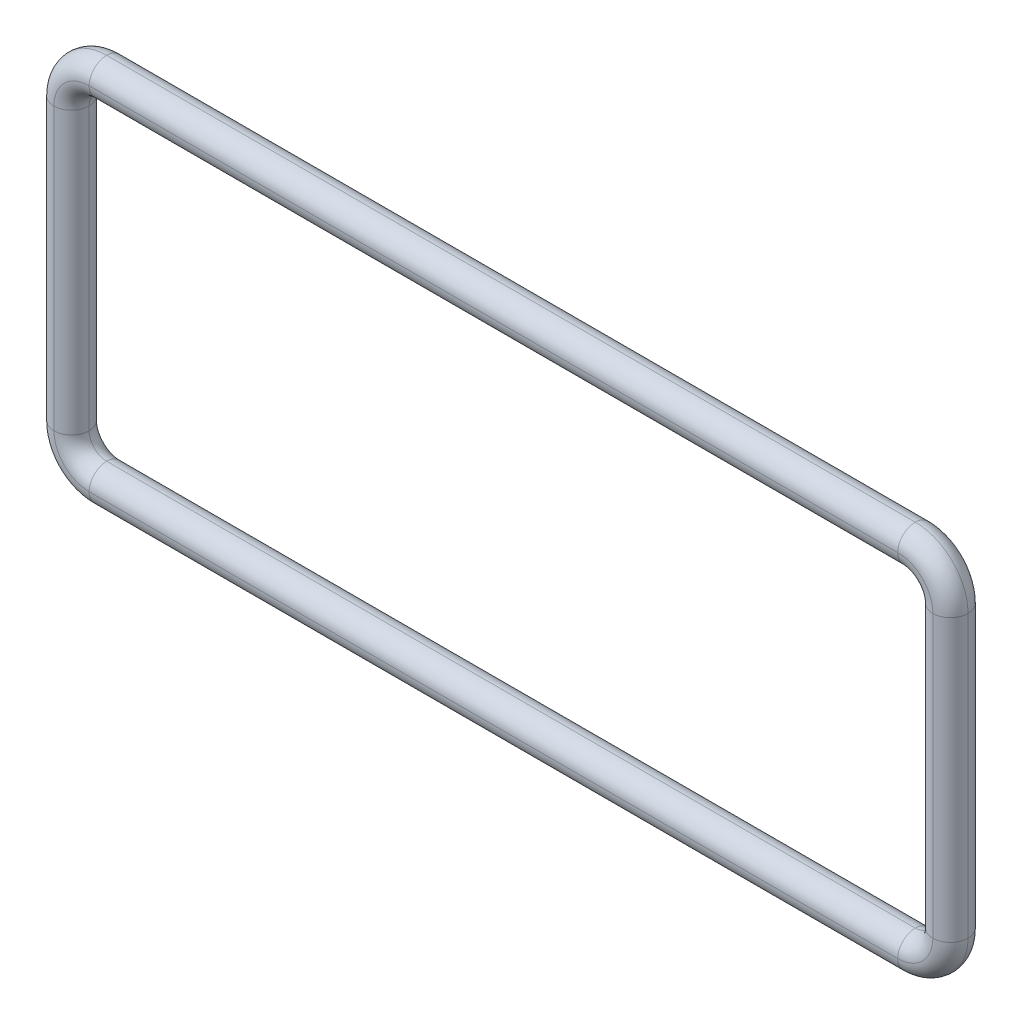
ISO-10303-21;
HEADER;
FILE_DESCRIPTION(('STEP AP214'),'2;1');
FILE_NAME('part.step','',(''),(''),'','','');
FILE_SCHEMA(('AUTOMOTIVE_DESIGN { 1 0 10303 214 1 1 1 1 }'));
ENDSEC;
DATA;
#1=APPLICATION_CONTEXT('core data for automotive mechanical design processes');
#2=APPLICATION_PROTOCOL_DEFINITION('international standard','automotive_design',2000,#1);
#3=PRODUCT_CONTEXT('',#1,'mechanical');
#4=PRODUCT('Part','Part','',(#3));
#5=PRODUCT_RELATED_PRODUCT_CATEGORY('part','',(#4));
#6=PRODUCT_DEFINITION_FORMATION('','',#4);
#7=PRODUCT_DEFINITION_CONTEXT('part definition',#1,'design');
#8=PRODUCT_DEFINITION('design','',#6,#7);
#9=PRODUCT_DEFINITION_SHAPE('','',#8);
#10=(LENGTH_UNIT() NAMED_UNIT(*) SI_UNIT(.MILLI.,.METRE.));
#11=(NAMED_UNIT(*) PLANE_ANGLE_UNIT() SI_UNIT($,.RADIAN.));
#12=(NAMED_UNIT(*) SI_UNIT($,.STERADIAN.) SOLID_ANGLE_UNIT());
#13=UNCERTAINTY_MEASURE_WITH_UNIT(LENGTH_MEASURE(1.E-05),#10,'distance_accuracy_value','');
#14=(GEOMETRIC_REPRESENTATION_CONTEXT(3) GLOBAL_UNCERTAINTY_ASSIGNED_CONTEXT((#13)) GLOBAL_UNIT_ASSIGNED_CONTEXT((#10,
#11,#12)) REPRESENTATION_CONTEXT('',''));
#15=CARTESIAN_POINT('',(0.,0.,0.));
#16=DIRECTION('',(0.,0.,1.));
#17=DIRECTION('',(1.,0.,0.));
#18=AXIS2_PLACEMENT_3D('',#15,#16,#17);
#19=CARTESIAN_POINT('',(52.,18.,2.));
#20=DIRECTION('',(0.,1.,0.));
#21=DIRECTION('',(0.,0.,1.));
#22=AXIS2_PLACEMENT_3D('',#19,#20,#21);
#23=CYLINDRICAL_SURFACE('',#22,2.);
#24=CARTESIAN_POINT('',(52.,-14.,2.));
#25=DIRECTION('',(0.,-1.,0.));
#26=DIRECTION('',(0.,0.,-1.));
#27=AXIS2_PLACEMENT_3D('',#24,#25,#26);
#28=CIRCLE('',#27,2.);
#29=CARTESIAN_POINT('',(54.,-14.,2.));
#30=VERTEX_POINT('',#29);
#31=CARTESIAN_POINT('',(52.,-14.,4.));
#32=VERTEX_POINT('',#31);
#33=EDGE_CURVE('E308',#30,#32,#28,.T.);
#34=ORIENTED_EDGE('',*,*,#33,.F.);
#35=DIRECTION('',(0.,1.,0.));
#36=VECTOR('',#35,1.);
#37=CARTESIAN_POINT('',(54.,18.,2.));
#38=LINE('',#37,#36);
#39=CARTESIAN_POINT('',(54.,18.,2.));
#40=VERTEX_POINT('',#39);
#41=EDGE_CURVE('E237',#40,#30,#38,.F.);
#42=ORIENTED_EDGE('',*,*,#41,.F.);
#43=CARTESIAN_POINT('',(52.,18.,2.));
#44=DIRECTION('',(0.,1.,0.));
#45=DIRECTION('',(0.,0.,1.));
#46=AXIS2_PLACEMENT_3D('',#43,#44,#45);
#47=CIRCLE('',#46,2.);
#48=CARTESIAN_POINT('',(52.,18.,4.));
#49=VERTEX_POINT('',#48);
#50=EDGE_CURVE('E222',#49,#40,#47,.T.);
#51=ORIENTED_EDGE('',*,*,#50,.F.);
#52=DIRECTION('',(0.,1.,0.));
#53=VECTOR('',#52,1.);
#54=CARTESIAN_POINT('',(52.,18.,4.));
#55=LINE('',#54,#53);
#56=EDGE_CURVE('E311',#32,#49,#55,.T.);
#57=ORIENTED_EDGE('',*,*,#56,.F.);
#58=EDGE_LOOP('',(#34,#42,#51,#57));
#59=FACE_BOUND('',#58,.T.);
#60=ADVANCED_FACE('F36',(#59),#23,.T.);
#61=CARTESIAN_POINT('',(48.,18.,2.));
#62=DIRECTION('',(0.,0.,-1.));
#63=DIRECTION('',(-1.,0.,0.));
#64=AXIS2_PLACEMENT_3D('',#61,#62,#63);
#65=TOROIDAL_SURFACE('',#64,4.,2.);
#66=ORIENTED_EDGE('',*,*,#50,.T.);
#67=CARTESIAN_POINT('',(48.,18.,2.));
#68=DIRECTION('',(0.,0.,-1.));
#69=DIRECTION('',(-1.,0.,0.));
#70=AXIS2_PLACEMENT_3D('',#67,#68,#69);
#71=CIRCLE('',#70,6.);
#72=CARTESIAN_POINT('',(48.,24.,2.));
#73=VERTEX_POINT('',#72);
#74=EDGE_CURVE('E11',#73,#40,#71,.T.);
#75=ORIENTED_EDGE('',*,*,#74,.F.);
#76=CARTESIAN_POINT('',(48.,22.,2.));
#77=DIRECTION('',(-1.,0.,0.));
#78=DIRECTION('',(0.,0.,1.));
#79=AXIS2_PLACEMENT_3D('',#76,#77,#78);
#80=CIRCLE('',#79,2.);
#81=CARTESIAN_POINT('',(48.,22.,4.));
#82=VERTEX_POINT('',#81);
#83=EDGE_CURVE('E306',#82,#73,#80,.T.);
#84=ORIENTED_EDGE('',*,*,#83,.F.);
#85=CARTESIAN_POINT('',(48.,18.,4.));
#86=DIRECTION('',(0.,0.,-1.));
#87=DIRECTION('',(-1.,0.,0.));
#88=AXIS2_PLACEMENT_3D('',#85,#86,#87);
#89=CIRCLE('',#88,4.);
#90=EDGE_CURVE('E303',#49,#82,#89,.F.);
#91=ORIENTED_EDGE('',*,*,#90,.F.);
#92=EDGE_LOOP('',(#66,#75,#84,#91));
#93=FACE_BOUND('',#92,.T.);
#94=ADVANCED_FACE('F391',(#93),#65,.T.);
#95=CARTESIAN_POINT('',(52.,18.,2.));
#96=DIRECTION('',(0.,-1.,0.));
#97=DIRECTION('',(1.,0.,0.));
#98=AXIS2_PLACEMENT_3D('',#95,#96,#97);
#99=CYLINDRICAL_SURFACE('',#98,2.);
#100=CARTESIAN_POINT('',(52.,-14.,2.));
#101=DIRECTION('',(0.,-1.,0.));
#102=DIRECTION('',(0.,0.,-1.));
#103=AXIS2_PLACEMENT_3D('',#100,#101,#102);
#104=CIRCLE('',#103,2.);
#105=CARTESIAN_POINT('',(50.,-14.,2.));
#106=VERTEX_POINT('',#105);
#107=EDGE_CURVE('E297',#32,#106,#104,.T.);
#108=ORIENTED_EDGE('',*,*,#107,.F.);
#109=ORIENTED_EDGE('',*,*,#56,.T.);
#110=CARTESIAN_POINT('',(52.,18.,2.));
#111=DIRECTION('',(0.,1.,0.));
#112=DIRECTION('',(0.,0.,1.));
#113=AXIS2_PLACEMENT_3D('',#110,#111,#112);
#114=CIRCLE('',#113,2.);
#115=CARTESIAN_POINT('',(50.,18.,2.));
#116=VERTEX_POINT('',#115);
#117=EDGE_CURVE('E300',#116,#49,#114,.T.);
#118=ORIENTED_EDGE('',*,*,#117,.F.);
#119=DIRECTION('',(0.,1.,0.));
#120=VECTOR('',#119,1.);
#121=CARTESIAN_POINT('',(50.,18.,2.));
#122=LINE('',#121,#120);
#123=EDGE_CURVE('E369',#106,#116,#122,.T.);
#124=ORIENTED_EDGE('',*,*,#123,.F.);
#125=EDGE_LOOP('',(#108,#109,#118,#124));
#126=FACE_BOUND('',#125,.T.);
#127=ADVANCED_FACE('F397',(#126),#99,.T.);
#128=CARTESIAN_POINT('',(48.,-14.,2.));
#129=DIRECTION('',(0.,0.,-1.));
#130=DIRECTION('',(-1.,0.,0.));
#131=AXIS2_PLACEMENT_3D('',#128,#129,#130);
#132=TOROIDAL_SURFACE('',#131,4.00000000000001,2.);
#133=CARTESIAN_POINT('',(48.,-14.,2.));
#134=DIRECTION('',(0.,0.,-1.));
#135=DIRECTION('',(-1.,0.,0.));
#136=AXIS2_PLACEMENT_3D('',#133,#134,#135);
#137=CIRCLE('',#136,6.00000000000001);
#138=CARTESIAN_POINT('',(48.,-20.,2.));
#139=VERTEX_POINT('',#138);
#140=EDGE_CURVE('E241',#30,#139,#137,.T.);
#141=ORIENTED_EDGE('',*,*,#140,.F.);
#142=ORIENTED_EDGE('',*,*,#33,.T.);
#143=CARTESIAN_POINT('',(48.,-14.,4.));
#144=DIRECTION('',(0.,0.,-1.));
#145=DIRECTION('',(-1.,0.,0.));
#146=AXIS2_PLACEMENT_3D('',#143,#144,#145);
#147=CIRCLE('',#146,4.00000000000001);
#148=CARTESIAN_POINT('',(48.,-18.,4.));
#149=VERTEX_POINT('',#148);
#150=EDGE_CURVE('E294',#149,#32,#147,.F.);
#151=ORIENTED_EDGE('',*,*,#150,.F.);
#152=CARTESIAN_POINT('',(48.,-18.,2.));
#153=DIRECTION('',(-1.,0.,0.));
#154=DIRECTION('',(0.,0.,1.));
#155=AXIS2_PLACEMENT_3D('',#152,#153,#154);
#156=CIRCLE('',#155,2.);
#157=EDGE_CURVE('E291',#139,#149,#156,.T.);
#158=ORIENTED_EDGE('',*,*,#157,.F.);
#159=EDGE_LOOP('',(#141,#142,#151,#158));
#160=FACE_BOUND('',#159,.T.);
#161=ADVANCED_FACE('F399',(#160),#132,.T.);
#162=CARTESIAN_POINT('',(48.,22.,2.));
#163=DIRECTION('',(-1.,0.,0.));
#164=DIRECTION('',(0.,0.,1.));
#165=AXIS2_PLACEMENT_3D('',#162,#163,#164);
#166=CYLINDRICAL_SURFACE('',#165,2.);
#167=ORIENTED_EDGE('',*,*,#83,.T.);
#168=DIRECTION('',(-1.,0.,0.));
#169=VECTOR('',#168,1.);
#170=CARTESIAN_POINT('',(-44.,24.,2.));
#171=LINE('',#170,#169);
#172=CARTESIAN_POINT('',(-44.,24.,2.));
#173=VERTEX_POINT('',#172);
#174=EDGE_CURVE('E46',#173,#73,#171,.F.);
#175=ORIENTED_EDGE('',*,*,#174,.F.);
#176=CARTESIAN_POINT('',(-44.,22.,2.));
#177=DIRECTION('',(-1.,0.,0.));
#178=DIRECTION('',(0.,0.,1.));
#179=AXIS2_PLACEMENT_3D('',#176,#177,#178);
#180=CIRCLE('',#179,2.);
#181=CARTESIAN_POINT('',(-44.,22.,4.));
#182=VERTEX_POINT('',#181);
#183=EDGE_CURVE('E288',#182,#173,#180,.T.);
#184=ORIENTED_EDGE('',*,*,#183,.F.);
#185=DIRECTION('',(-1.,0.,0.));
#186=VECTOR('',#185,1.);
#187=CARTESIAN_POINT('',(48.,22.,4.));
#188=LINE('',#187,#186);
#189=EDGE_CURVE('E285',#82,#182,#188,.T.);
#190=ORIENTED_EDGE('',*,*,#189,.F.);
#191=EDGE_LOOP('',(#167,#175,#184,#190));
#192=FACE_BOUND('',#191,.T.);
#193=ADVANCED_FACE('F675',(#192),#166,.T.);
#194=CARTESIAN_POINT('',(48.,18.,2.));
#195=DIRECTION('',(0.,0.,-1.));
#196=DIRECTION('',(-1.,0.,0.));
#197=AXIS2_PLACEMENT_3D('',#194,#195,#196);
#198=TOROIDAL_SURFACE('',#197,4.,2.);
#199=ORIENTED_EDGE('',*,*,#117,.T.);
#200=ORIENTED_EDGE('',*,*,#90,.T.);
#201=CARTESIAN_POINT('',(48.,22.,2.));
#202=DIRECTION('',(-1.,0.,0.));
#203=DIRECTION('',(0.,0.,1.));
#204=AXIS2_PLACEMENT_3D('',#201,#202,#203);
#205=CIRCLE('',#204,2.);
#206=CARTESIAN_POINT('',(48.,20.,2.));
#207=VERTEX_POINT('',#206);
#208=EDGE_CURVE('E282',#207,#82,#205,.T.);
#209=ORIENTED_EDGE('',*,*,#208,.F.);
#210=CARTESIAN_POINT('',(48.,18.,2.));
#211=DIRECTION('',(0.,0.,-1.));
#212=DIRECTION('',(-1.,0.,0.));
#213=AXIS2_PLACEMENT_3D('',#210,#211,#212);
#214=CIRCLE('',#213,2.);
#215=EDGE_CURVE('E243',#116,#207,#214,.F.);
#216=ORIENTED_EDGE('',*,*,#215,.F.);
#217=EDGE_LOOP('',(#199,#200,#209,#216));
#218=FACE_BOUND('',#217,.T.);
#219=ADVANCED_FACE('F394',(#218),#198,.T.);
#220=CARTESIAN_POINT('',(48.,-14.,2.));
#221=DIRECTION('',(0.,0.,-1.));
#222=DIRECTION('',(-1.,0.,0.));
#223=AXIS2_PLACEMENT_3D('',#220,#221,#222);
#224=TOROIDAL_SURFACE('',#223,4.00000000000001,2.);
#225=ORIENTED_EDGE('',*,*,#107,.T.);
#226=CARTESIAN_POINT('',(48.,-14.,2.));
#227=DIRECTION('',(0.,0.,-1.));
#228=DIRECTION('',(-1.,0.,0.));
#229=AXIS2_PLACEMENT_3D('',#226,#227,#228);
#230=CIRCLE('',#229,2.00000000000001);
#231=CARTESIAN_POINT('',(48.,-16.,2.));
#232=VERTEX_POINT('',#231);
#233=EDGE_CURVE('E370',#232,#106,#230,.F.);
#234=ORIENTED_EDGE('',*,*,#233,.F.);
#235=CARTESIAN_POINT('',(48.,-18.,2.));
#236=DIRECTION('',(-1.,0.,0.));
#237=DIRECTION('',(0.,0.,1.));
#238=AXIS2_PLACEMENT_3D('',#235,#236,#237);
#239=CIRCLE('',#238,2.);
#240=EDGE_CURVE('E279',#149,#232,#239,.T.);
#241=ORIENTED_EDGE('',*,*,#240,.F.);
#242=ORIENTED_EDGE('',*,*,#150,.T.);
#243=EDGE_LOOP('',(#225,#234,#241,#242));
#244=FACE_BOUND('',#243,.T.);
#245=ADVANCED_FACE('F657',(#244),#224,.T.);
#246=CARTESIAN_POINT('',(48.,-18.,2.));
#247=DIRECTION('',(1.,0.,0.));
#248=DIRECTION('',(0.,1.,0.));
#249=AXIS2_PLACEMENT_3D('',#246,#247,#248);
#250=CYLINDRICAL_SURFACE('',#249,2.);
#251=DIRECTION('',(1.,0.,0.));
#252=VECTOR('',#251,1.);
#253=CARTESIAN_POINT('',(-44.,-20.,2.));
#254=LINE('',#253,#252);
#255=CARTESIAN_POINT('',(-44.,-20.,2.));
#256=VERTEX_POINT('',#255);
#257=EDGE_CURVE('E120',#139,#256,#254,.F.);
#258=ORIENTED_EDGE('',*,*,#257,.F.);
#259=ORIENTED_EDGE('',*,*,#157,.T.);
#260=DIRECTION('',(1.,0.,0.));
#261=VECTOR('',#260,1.);
#262=CARTESIAN_POINT('',(48.,-18.,4.));
#263=LINE('',#262,#261);
#264=CARTESIAN_POINT('',(-44.,-18.,4.));
#265=VERTEX_POINT('',#264);
#266=EDGE_CURVE('E276',#265,#149,#263,.T.);
#267=ORIENTED_EDGE('',*,*,#266,.F.);
#268=CARTESIAN_POINT('',(-44.,-18.,2.));
#269=DIRECTION('',(-1.,0.,0.));
#270=DIRECTION('',(0.,0.,1.));
#271=AXIS2_PLACEMENT_3D('',#268,#269,#270);
#272=CIRCLE('',#271,2.);
#273=EDGE_CURVE('E273',#256,#265,#272,.T.);
#274=ORIENTED_EDGE('',*,*,#273,.F.);
#275=EDGE_LOOP('',(#258,#259,#267,#274));
#276=FACE_BOUND('',#275,.T.);
#277=ADVANCED_FACE('F402',(#276),#250,.T.);
#278=CARTESIAN_POINT('',(-44.,18.,2.));
#279=DIRECTION('',(0.,0.,-1.));
#280=DIRECTION('',(-1.,0.,0.));
#281=AXIS2_PLACEMENT_3D('',#278,#279,#280);
#282=TOROIDAL_SURFACE('',#281,4.,2.);
#283=ORIENTED_EDGE('',*,*,#183,.T.);
#284=CARTESIAN_POINT('',(-44.,18.,2.));
#285=DIRECTION('',(0.,0.,-1.));
#286=DIRECTION('',(-1.,0.,0.));
#287=AXIS2_PLACEMENT_3D('',#284,#285,#286);
#288=CIRCLE('',#287,6.);
#289=CARTESIAN_POINT('',(-50.,18.,2.));
#290=VERTEX_POINT('',#289);
#291=EDGE_CURVE('E253',#290,#173,#288,.T.);
#292=ORIENTED_EDGE('',*,*,#291,.F.);
#293=CARTESIAN_POINT('',(-48.,18.,2.));
#294=DIRECTION('',(0.,-1.,0.));
#295=DIRECTION('',(0.,0.,-1.));
#296=AXIS2_PLACEMENT_3D('',#293,#294,#295);
#297=CIRCLE('',#296,2.);
#298=CARTESIAN_POINT('',(-48.,18.,4.));
#299=VERTEX_POINT('',#298);
#300=EDGE_CURVE('E269',#299,#290,#297,.T.);
#301=ORIENTED_EDGE('',*,*,#300,.F.);
#302=CARTESIAN_POINT('',(-44.,18.,4.));
#303=DIRECTION('',(0.,0.,-1.));
#304=DIRECTION('',(-1.,0.,0.));
#305=AXIS2_PLACEMENT_3D('',#302,#303,#304);
#306=CIRCLE('',#305,4.);
#307=EDGE_CURVE('E210',#182,#299,#306,.F.);
#308=ORIENTED_EDGE('',*,*,#307,.F.);
#309=EDGE_LOOP('',(#283,#292,#301,#308));
#310=FACE_BOUND('',#309,.T.);
#311=ADVANCED_FACE('F639',(#310),#282,.T.);
#312=CARTESIAN_POINT('',(-44.,22.,2.));
#313=DIRECTION('',(1.,0.,0.));
#314=DIRECTION('',(0.,1.,0.));
#315=AXIS2_PLACEMENT_3D('',#312,#313,#314);
#316=CYLINDRICAL_SURFACE('',#315,2.);
#317=ORIENTED_EDGE('',*,*,#208,.T.);
#318=ORIENTED_EDGE('',*,*,#189,.T.);
#319=CARTESIAN_POINT('',(-44.,22.,2.));
#320=DIRECTION('',(-1.,0.,0.));
#321=DIRECTION('',(0.,0.,1.));
#322=AXIS2_PLACEMENT_3D('',#319,#320,#321);
#323=CIRCLE('',#322,2.);
#324=CARTESIAN_POINT('',(-44.,20.,2.));
#325=VERTEX_POINT('',#324);
#326=EDGE_CURVE('E266',#325,#182,#323,.T.);
#327=ORIENTED_EDGE('',*,*,#326,.F.);
#328=DIRECTION('',(-1.,0.,0.));
#329=VECTOR('',#328,1.);
#330=CARTESIAN_POINT('',(-44.,20.,2.));
#331=LINE('',#330,#329);
#332=EDGE_CURVE('E238',#207,#325,#331,.T.);
#333=ORIENTED_EDGE('',*,*,#332,.F.);
#334=EDGE_LOOP('',(#317,#318,#327,#333));
#335=FACE_BOUND('',#334,.T.);
#336=ADVANCED_FACE('F362',(#335),#316,.T.);
#337=CARTESIAN_POINT('',(-44.,-18.,2.));
#338=DIRECTION('',(-1.,0.,0.));
#339=DIRECTION('',(0.,0.,1.));
#340=AXIS2_PLACEMENT_3D('',#337,#338,#339);
#341=CYLINDRICAL_SURFACE('',#340,2.);
#342=ORIENTED_EDGE('',*,*,#240,.T.);
#343=DIRECTION('',(1.,0.,0.));
#344=VECTOR('',#343,1.);
#345=CARTESIAN_POINT('',(48.,-16.,2.));
#346=LINE('',#345,#344);
#347=CARTESIAN_POINT('',(-44.,-16.,2.));
#348=VERTEX_POINT('',#347);
#349=EDGE_CURVE('E375',#348,#232,#346,.T.);
#350=ORIENTED_EDGE('',*,*,#349,.F.);
#351=CARTESIAN_POINT('',(-44.,-18.,2.));
#352=DIRECTION('',(-1.,0.,0.));
#353=DIRECTION('',(0.,0.,1.));
#354=AXIS2_PLACEMENT_3D('',#351,#352,#353);
#355=CIRCLE('',#354,2.);
#356=EDGE_CURVE('E263',#265,#348,#355,.T.);
#357=ORIENTED_EDGE('',*,*,#356,.F.);
#358=ORIENTED_EDGE('',*,*,#266,.T.);
#359=EDGE_LOOP('',(#342,#350,#357,#358));
#360=FACE_BOUND('',#359,.T.);
#361=ADVANCED_FACE('F406',(#360),#341,.T.);
#362=CARTESIAN_POINT('',(-44.,-14.,2.));
#363=DIRECTION('',(0.,0.,-1.));
#364=DIRECTION('',(-1.,0.,0.));
#365=AXIS2_PLACEMENT_3D('',#362,#363,#364);
#366=TOROIDAL_SURFACE('',#365,4.,2.);
#367=CARTESIAN_POINT('',(-48.,-14.,2.));
#368=DIRECTION('',(0.,1.,0.));
#369=DIRECTION('',(-1.,0.,0.));
#370=AXIS2_PLACEMENT_3D('',#367,#368,#369);
#371=CIRCLE('',#370,2.);
#372=CARTESIAN_POINT('',(-50.,-14.,2.));
#373=VERTEX_POINT('',#372);
#374=CARTESIAN_POINT('',(-48.,-14.,4.));
#375=VERTEX_POINT('',#374);
#376=EDGE_CURVE('E163',#373,#375,#371,.T.);
#377=ORIENTED_EDGE('',*,*,#376,.F.);
#378=CARTESIAN_POINT('',(-44.,-14.,2.));
#379=DIRECTION('',(0.,0.,-1.));
#380=DIRECTION('',(-1.,0.,0.));
#381=AXIS2_PLACEMENT_3D('',#378,#379,#380);
#382=CIRCLE('',#381,6.);
#383=EDGE_CURVE('E250',#256,#373,#382,.T.);
#384=ORIENTED_EDGE('',*,*,#383,.F.);
#385=ORIENTED_EDGE('',*,*,#273,.T.);
#386=CARTESIAN_POINT('',(-44.,-14.,4.));
#387=DIRECTION('',(0.,0.,-1.));
#388=DIRECTION('',(-1.,0.,0.));
#389=AXIS2_PLACEMENT_3D('',#386,#387,#388);
#390=CIRCLE('',#389,4.);
#391=EDGE_CURVE('E260',#375,#265,#390,.F.);
#392=ORIENTED_EDGE('',*,*,#391,.F.);
#393=EDGE_LOOP('',(#377,#384,#385,#392));
#394=FACE_BOUND('',#393,.T.);
#395=ADVANCED_FACE('F403',(#394),#366,.T.);
#396=CARTESIAN_POINT('',(-48.,18.,2.));
#397=DIRECTION('',(0.,-1.,0.));
#398=DIRECTION('',(0.,0.,-1.));
#399=AXIS2_PLACEMENT_3D('',#396,#397,#398);
#400=CYLINDRICAL_SURFACE('',#399,2.);
#401=DIRECTION('',(0.,-1.,0.));
#402=VECTOR('',#401,1.);
#403=CARTESIAN_POINT('',(-50.,18.,2.));
#404=LINE('',#403,#402);
#405=EDGE_CURVE('E153',#373,#290,#404,.F.);
#406=ORIENTED_EDGE('',*,*,#405,.F.);
#407=ORIENTED_EDGE('',*,*,#376,.T.);
#408=DIRECTION('',(0.,-1.,0.));
#409=VECTOR('',#408,1.);
#410=CARTESIAN_POINT('',(-48.,18.,4.));
#411=LINE('',#410,#409);
#412=EDGE_CURVE('E214',#299,#375,#411,.T.);
#413=ORIENTED_EDGE('',*,*,#412,.F.);
#414=ORIENTED_EDGE('',*,*,#300,.T.);
#415=EDGE_LOOP('',(#406,#407,#413,#414));
#416=FACE_BOUND('',#415,.T.);
#417=ADVANCED_FACE('F405',(#416),#400,.T.);
#418=CARTESIAN_POINT('',(-44.,18.,2.));
#419=DIRECTION('',(0.,0.,-1.));
#420=DIRECTION('',(-1.,0.,0.));
#421=AXIS2_PLACEMENT_3D('',#418,#419,#420);
#422=TOROIDAL_SURFACE('',#421,4.,2.);
#423=ORIENTED_EDGE('',*,*,#326,.T.);
#424=ORIENTED_EDGE('',*,*,#307,.T.);
#425=CARTESIAN_POINT('',(-48.,18.,2.));
#426=DIRECTION('',(0.,-1.,0.));
#427=DIRECTION('',(0.,0.,-1.));
#428=AXIS2_PLACEMENT_3D('',#425,#426,#427);
#429=CIRCLE('',#428,2.);
#430=CARTESIAN_POINT('',(-46.,18.,2.));
#431=VERTEX_POINT('',#430);
#432=EDGE_CURVE('E202',#431,#299,#429,.T.);
#433=ORIENTED_EDGE('',*,*,#432,.F.);
#434=CARTESIAN_POINT('',(-44.,18.,2.));
#435=DIRECTION('',(0.,0.,-1.));
#436=DIRECTION('',(-1.,0.,0.));
#437=AXIS2_PLACEMENT_3D('',#434,#435,#436);
#438=CIRCLE('',#437,2.);
#439=EDGE_CURVE('E207',#325,#431,#438,.F.);
#440=ORIENTED_EDGE('',*,*,#439,.F.);
#441=EDGE_LOOP('',(#423,#424,#433,#440));
#442=FACE_BOUND('',#441,.T.);
#443=ADVANCED_FACE('F205',(#442),#422,.T.);
#444=CARTESIAN_POINT('',(-44.,-14.,2.));
#445=DIRECTION('',(0.,0.,-1.));
#446=DIRECTION('',(-1.,0.,0.));
#447=AXIS2_PLACEMENT_3D('',#444,#445,#446);
#448=TOROIDAL_SURFACE('',#447,4.,2.);
#449=ORIENTED_EDGE('',*,*,#356,.T.);
#450=CARTESIAN_POINT('',(-44.,-14.,2.));
#451=DIRECTION('',(0.,0.,-1.));
#452=DIRECTION('',(-1.,0.,0.));
#453=AXIS2_PLACEMENT_3D('',#450,#451,#452);
#454=CIRCLE('',#453,2.);
#455=CARTESIAN_POINT('',(-46.,-14.,2.));
#456=VERTEX_POINT('',#455);
#457=EDGE_CURVE('E134',#456,#348,#454,.F.);
#458=ORIENTED_EDGE('',*,*,#457,.F.);
#459=CARTESIAN_POINT('',(-48.,-14.,2.));
#460=DIRECTION('',(0.,1.,0.));
#461=DIRECTION('',(0.,0.,1.));
#462=AXIS2_PLACEMENT_3D('',#459,#460,#461);
#463=CIRCLE('',#462,2.);
#464=EDGE_CURVE('E121',#375,#456,#463,.T.);
#465=ORIENTED_EDGE('',*,*,#464,.F.);
#466=ORIENTED_EDGE('',*,*,#391,.T.);
#467=EDGE_LOOP('',(#449,#458,#465,#466));
#468=FACE_BOUND('',#467,.T.);
#469=ADVANCED_FACE('F461',(#468),#448,.T.);
#470=CARTESIAN_POINT('',(-48.,18.,2.));
#471=DIRECTION('',(0.,1.,0.));
#472=DIRECTION('',(0.,0.,1.));
#473=AXIS2_PLACEMENT_3D('',#470,#471,#472);
#474=CYLINDRICAL_SURFACE('',#473,2.);
#475=ORIENTED_EDGE('',*,*,#432,.T.);
#476=ORIENTED_EDGE('',*,*,#412,.T.);
#477=ORIENTED_EDGE('',*,*,#464,.T.);
#478=DIRECTION('',(0.,-1.,0.));
#479=VECTOR('',#478,1.);
#480=CARTESIAN_POINT('',(-46.,-14.,2.));
#481=LINE('',#480,#479);
#482=EDGE_CURVE('E217',#431,#456,#481,.T.);
#483=ORIENTED_EDGE('',*,*,#482,.F.);
#484=EDGE_LOOP('',(#475,#476,#477,#483));
#485=FACE_BOUND('',#484,.T.);
#486=ADVANCED_FACE('F219',(#485),#474,.T.);
#487=CARTESIAN_POINT('',(-44.,-14.,2.));
#488=DIRECTION('',(0.,0.,-1.));
#489=DIRECTION('',(-1.,0.,0.));
#490=AXIS2_PLACEMENT_3D('',#487,#488,#489);
#491=TOROIDAL_SURFACE('',#490,4.,2.);
#492=CARTESIAN_POINT('',(-44.,-18.,2.));
#493=DIRECTION('',(1.,0.,0.));
#494=DIRECTION('',(0.,0.,-1.));
#495=AXIS2_PLACEMENT_3D('',#492,#493,#494);
#496=CIRCLE('',#495,2.);
#497=CARTESIAN_POINT('',(-44.,-18.,0.));
#498=VERTEX_POINT('',#497);
#499=EDGE_CURVE('E40',#256,#498,#496,.T.);
#500=ORIENTED_EDGE('',*,*,#499,.F.);
#501=ORIENTED_EDGE('',*,*,#383,.T.);
#502=CARTESIAN_POINT('',(-48.,-14.,2.));
#503=DIRECTION('',(0.,1.,0.));
#504=DIRECTION('',(0.,0.,1.));
#505=AXIS2_PLACEMENT_3D('',#502,#503,#504);
#506=CIRCLE('',#505,2.);
#507=CARTESIAN_POINT('',(-48.,-14.,0.));
#508=VERTEX_POINT('',#507);
#509=EDGE_CURVE('E107',#508,#373,#506,.T.);
#510=ORIENTED_EDGE('',*,*,#509,.F.);
#511=CARTESIAN_POINT('',(-44.,-14.,0.));
#512=DIRECTION('',(0.,0.,-1.));
#513=DIRECTION('',(-1.,0.,0.));
#514=AXIS2_PLACEMENT_3D('',#511,#512,#513);
#515=CIRCLE('',#514,4.);
#516=EDGE_CURVE('E122',#498,#508,#515,.T.);
#517=ORIENTED_EDGE('',*,*,#516,.F.);
#518=EDGE_LOOP('',(#500,#501,#510,#517));
#519=FACE_BOUND('',#518,.T.);
#520=ADVANCED_FACE('F38',(#519),#491,.T.);
#521=CARTESIAN_POINT('',(-44.,-18.,2.));
#522=DIRECTION('',(-1.,0.,0.));
#523=DIRECTION('',(0.,-1.,0.));
#524=AXIS2_PLACEMENT_3D('',#521,#522,#523);
#525=CYLINDRICAL_SURFACE('',#524,2.);
#526=ORIENTED_EDGE('',*,*,#257,.T.);
#527=ORIENTED_EDGE('',*,*,#499,.T.);
#528=DIRECTION('',(1.,0.,0.));
#529=VECTOR('',#528,1.);
#530=CARTESIAN_POINT('',(-44.,-18.,0.));
#531=LINE('',#530,#529);
#532=CARTESIAN_POINT('',(48.,-18.,0.));
#533=VERTEX_POINT('',#532);
#534=EDGE_CURVE('E116',#533,#498,#531,.F.);
#535=ORIENTED_EDGE('',*,*,#534,.F.);
#536=CARTESIAN_POINT('',(48.,-18.,2.));
#537=DIRECTION('',(1.,0.,0.));
#538=DIRECTION('',(0.,0.,-1.));
#539=AXIS2_PLACEMENT_3D('',#536,#537,#538);
#540=CIRCLE('',#539,2.);
#541=EDGE_CURVE('E143',#139,#533,#540,.T.);
#542=ORIENTED_EDGE('',*,*,#541,.F.);
#543=EDGE_LOOP('',(#526,#527,#535,#542));
#544=FACE_BOUND('',#543,.T.);
#545=ADVANCED_FACE('F113',(#544),#525,.T.);
#546=CARTESIAN_POINT('',(-48.,18.,2.));
#547=DIRECTION('',(0.,1.,0.));
#548=DIRECTION('',(0.,0.,1.));
#549=AXIS2_PLACEMENT_3D('',#546,#547,#548);
#550=CYLINDRICAL_SURFACE('',#549,2.);
#551=ORIENTED_EDGE('',*,*,#509,.T.);
#552=ORIENTED_EDGE('',*,*,#405,.T.);
#553=CARTESIAN_POINT('',(-48.,18.,2.));
#554=DIRECTION('',(0.,1.,0.));
#555=DIRECTION('',(0.,0.,1.));
#556=AXIS2_PLACEMENT_3D('',#553,#554,#555);
#557=CIRCLE('',#556,2.);
#558=CARTESIAN_POINT('',(-48.,18.,0.));
#559=VERTEX_POINT('',#558);
#560=EDGE_CURVE('E145',#559,#290,#557,.T.);
#561=ORIENTED_EDGE('',*,*,#560,.F.);
#562=DIRECTION('',(0.,-1.,0.));
#563=VECTOR('',#562,1.);
#564=CARTESIAN_POINT('',(-48.,18.,0.));
#565=LINE('',#564,#563);
#566=EDGE_CURVE('E156',#508,#559,#565,.F.);
#567=ORIENTED_EDGE('',*,*,#566,.F.);
#568=EDGE_LOOP('',(#551,#552,#561,#567));
#569=FACE_BOUND('',#568,.T.);
#570=ADVANCED_FACE('F151',(#569),#550,.T.);
#571=CARTESIAN_POINT('',(-44.,-14.,2.));
#572=DIRECTION('',(0.,0.,-1.));
#573=DIRECTION('',(-1.,0.,0.));
#574=AXIS2_PLACEMENT_3D('',#571,#572,#573);
#575=TOROIDAL_SURFACE('',#574,4.,2.);
#576=CARTESIAN_POINT('',(-48.,-14.,2.));
#577=DIRECTION('',(0.,1.,0.));
#578=DIRECTION('',(-1.,0.,0.));
#579=AXIS2_PLACEMENT_3D('',#576,#577,#578);
#580=CIRCLE('',#579,2.);
#581=EDGE_CURVE('E347',#456,#508,#580,.T.);
#582=ORIENTED_EDGE('',*,*,#581,.F.);
#583=ORIENTED_EDGE('',*,*,#457,.T.);
#584=CARTESIAN_POINT('',(-44.,-18.,2.));
#585=DIRECTION('',(1.,0.,0.));
#586=DIRECTION('',(0.,0.,-1.));
#587=AXIS2_PLACEMENT_3D('',#584,#585,#586);
#588=CIRCLE('',#587,2.);
#589=EDGE_CURVE('E127',#498,#348,#588,.T.);
#590=ORIENTED_EDGE('',*,*,#589,.F.);
#591=ORIENTED_EDGE('',*,*,#516,.T.);
#592=EDGE_LOOP('',(#582,#583,#590,#591));
#593=FACE_BOUND('',#592,.T.);
#594=ADVANCED_FACE('F131',(#593),#575,.T.);
#595=CARTESIAN_POINT('',(48.,-18.,2.));
#596=DIRECTION('',(1.,0.,0.));
#597=DIRECTION('',(0.,0.,-1.));
#598=AXIS2_PLACEMENT_3D('',#595,#596,#597);
#599=CYLINDRICAL_SURFACE('',#598,2.);
#600=ORIENTED_EDGE('',*,*,#589,.T.);
#601=ORIENTED_EDGE('',*,*,#349,.T.);
#602=CARTESIAN_POINT('',(48.,-18.,2.));
#603=DIRECTION('',(1.,0.,0.));
#604=DIRECTION('',(0.,0.,-1.));
#605=AXIS2_PLACEMENT_3D('',#602,#603,#604);
#606=CIRCLE('',#605,2.);
#607=EDGE_CURVE('E141',#533,#232,#606,.T.);
#608=ORIENTED_EDGE('',*,*,#607,.F.);
#609=ORIENTED_EDGE('',*,*,#534,.T.);
#610=EDGE_LOOP('',(#600,#601,#608,#609));
#611=FACE_BOUND('',#610,.T.);
#612=ADVANCED_FACE('F139',(#611),#599,.T.);
#613=CARTESIAN_POINT('',(48.,-14.,2.));
#614=DIRECTION('',(0.,0.,-1.));
#615=DIRECTION('',(-1.,0.,0.));
#616=AXIS2_PLACEMENT_3D('',#613,#614,#615);
#617=TOROIDAL_SURFACE('',#616,4.00000000000001,2.);
#618=ORIENTED_EDGE('',*,*,#140,.T.);
#619=ORIENTED_EDGE('',*,*,#541,.T.);
#620=CARTESIAN_POINT('',(48.,-14.,0.));
#621=DIRECTION('',(0.,0.,-1.));
#622=DIRECTION('',(-1.,0.,0.));
#623=AXIS2_PLACEMENT_3D('',#620,#621,#622);
#624=CIRCLE('',#623,4.00000000000001);
#625=CARTESIAN_POINT('',(52.,-14.,0.));
#626=VERTEX_POINT('',#625);
#627=EDGE_CURVE('E344',#626,#533,#624,.T.);
#628=ORIENTED_EDGE('',*,*,#627,.F.);
#629=CARTESIAN_POINT('',(52.,-14.,2.));
#630=DIRECTION('',(0.,1.,0.));
#631=DIRECTION('',(0.,0.,1.));
#632=AXIS2_PLACEMENT_3D('',#629,#630,#631);
#633=CIRCLE('',#632,2.);
#634=EDGE_CURVE('E341',#30,#626,#633,.T.);
#635=ORIENTED_EDGE('',*,*,#634,.F.);
#636=EDGE_LOOP('',(#618,#619,#628,#635));
#637=FACE_BOUND('',#636,.T.);
#638=ADVANCED_FACE('F384',(#637),#617,.T.);
#639=CARTESIAN_POINT('',(-44.,18.,2.));
#640=DIRECTION('',(0.,0.,-1.));
#641=DIRECTION('',(-1.,0.,0.));
#642=AXIS2_PLACEMENT_3D('',#639,#640,#641);
#643=TOROIDAL_SURFACE('',#642,4.,2.);
#644=ORIENTED_EDGE('',*,*,#560,.T.);
#645=ORIENTED_EDGE('',*,*,#291,.T.);
#646=CARTESIAN_POINT('',(-44.,22.,2.));
#647=DIRECTION('',(1.,0.,0.));
#648=DIRECTION('',(0.,0.,-1.));
#649=AXIS2_PLACEMENT_3D('',#646,#647,#648);
#650=CIRCLE('',#649,2.);
#651=CARTESIAN_POINT('',(-44.,22.,0.));
#652=VERTEX_POINT('',#651);
#653=EDGE_CURVE('E339',#652,#173,#650,.T.);
#654=ORIENTED_EDGE('',*,*,#653,.F.);
#655=CARTESIAN_POINT('',(-44.,18.,0.));
#656=DIRECTION('',(0.,0.,-1.));
#657=DIRECTION('',(-1.,0.,0.));
#658=AXIS2_PLACEMENT_3D('',#655,#656,#657);
#659=CIRCLE('',#658,4.);
#660=EDGE_CURVE('E230',#559,#652,#659,.T.);
#661=ORIENTED_EDGE('',*,*,#660,.F.);
#662=EDGE_LOOP('',(#644,#645,#654,#661));
#663=FACE_BOUND('',#662,.T.);
#664=ADVANCED_FACE('F350',(#663),#643,.T.);
#665=CARTESIAN_POINT('',(-48.,18.,2.));
#666=DIRECTION('',(0.,-1.,0.));
#667=DIRECTION('',(0.,0.,-1.));
#668=AXIS2_PLACEMENT_3D('',#665,#666,#667);
#669=CYLINDRICAL_SURFACE('',#668,2.);
#670=ORIENTED_EDGE('',*,*,#581,.T.);
#671=ORIENTED_EDGE('',*,*,#566,.T.);
#672=CARTESIAN_POINT('',(-48.,18.,2.));
#673=DIRECTION('',(0.,1.,0.));
#674=DIRECTION('',(0.,0.,1.));
#675=AXIS2_PLACEMENT_3D('',#672,#673,#674);
#676=CIRCLE('',#675,2.);
#677=EDGE_CURVE('E225',#431,#559,#676,.T.);
#678=ORIENTED_EDGE('',*,*,#677,.F.);
#679=ORIENTED_EDGE('',*,*,#482,.T.);
#680=EDGE_LOOP('',(#670,#671,#678,#679));
#681=FACE_BOUND('',#680,.T.);
#682=ADVANCED_FACE('F226',(#681),#669,.T.);
#683=CARTESIAN_POINT('',(48.,-14.,2.));
#684=DIRECTION('',(0.,0.,-1.));
#685=DIRECTION('',(-1.,0.,0.));
#686=AXIS2_PLACEMENT_3D('',#683,#684,#685);
#687=TOROIDAL_SURFACE('',#686,4.00000000000001,2.);
#688=ORIENTED_EDGE('',*,*,#607,.T.);
#689=ORIENTED_EDGE('',*,*,#233,.T.);
#690=CARTESIAN_POINT('',(52.,-14.,2.));
#691=DIRECTION('',(0.,1.,0.));
#692=DIRECTION('',(-1.,0.,0.));
#693=AXIS2_PLACEMENT_3D('',#690,#691,#692);
#694=CIRCLE('',#693,2.);
#695=EDGE_CURVE('E231',#626,#106,#694,.T.);
#696=ORIENTED_EDGE('',*,*,#695,.F.);
#697=ORIENTED_EDGE('',*,*,#627,.T.);
#698=EDGE_LOOP('',(#688,#689,#696,#697));
#699=FACE_BOUND('',#698,.T.);
#700=ADVANCED_FACE('F380',(#699),#687,.T.);
#701=CARTESIAN_POINT('',(52.,18.,2.));
#702=DIRECTION('',(0.,-1.,0.));
#703=DIRECTION('',(0.,0.,-1.));
#704=AXIS2_PLACEMENT_3D('',#701,#702,#703);
#705=CYLINDRICAL_SURFACE('',#704,2.);
#706=ORIENTED_EDGE('',*,*,#41,.T.);
#707=ORIENTED_EDGE('',*,*,#634,.T.);
#708=DIRECTION('',(0.,1.,0.));
#709=VECTOR('',#708,1.);
#710=CARTESIAN_POINT('',(52.,-14.,0.));
#711=LINE('',#710,#709);
#712=CARTESIAN_POINT('',(52.,18.,0.));
#713=VERTEX_POINT('',#712);
#714=EDGE_CURVE('E333',#713,#626,#711,.F.);
#715=ORIENTED_EDGE('',*,*,#714,.F.);
#716=CARTESIAN_POINT('',(52.,18.,2.));
#717=DIRECTION('',(0.,1.,0.));
#718=DIRECTION('',(0.,0.,1.));
#719=AXIS2_PLACEMENT_3D('',#716,#717,#718);
#720=CIRCLE('',#719,2.);
#721=EDGE_CURVE('E330',#40,#713,#720,.T.);
#722=ORIENTED_EDGE('',*,*,#721,.F.);
#723=EDGE_LOOP('',(#706,#707,#715,#722));
#724=FACE_BOUND('',#723,.T.);
#725=ADVANCED_FACE('F386',(#724),#705,.T.);
#726=CARTESIAN_POINT('',(-44.,22.,2.));
#727=DIRECTION('',(1.,0.,0.));
#728=DIRECTION('',(0.,0.,-1.));
#729=AXIS2_PLACEMENT_3D('',#726,#727,#728);
#730=CYLINDRICAL_SURFACE('',#729,2.);
#731=ORIENTED_EDGE('',*,*,#653,.T.);
#732=ORIENTED_EDGE('',*,*,#174,.T.);
#733=CARTESIAN_POINT('',(48.,22.,2.));
#734=DIRECTION('',(1.,0.,0.));
#735=DIRECTION('',(0.,0.,-1.));
#736=AXIS2_PLACEMENT_3D('',#733,#734,#735);
#737=CIRCLE('',#736,2.);
#738=CARTESIAN_POINT('',(48.,22.,0.));
#739=VERTEX_POINT('',#738);
#740=EDGE_CURVE('E327',#739,#73,#737,.T.);
#741=ORIENTED_EDGE('',*,*,#740,.F.);
#742=DIRECTION('',(-1.,0.,0.));
#743=VECTOR('',#742,1.);
#744=CARTESIAN_POINT('',(48.,22.,0.));
#745=LINE('',#744,#743);
#746=EDGE_CURVE('E324',#652,#739,#745,.F.);
#747=ORIENTED_EDGE('',*,*,#746,.F.);
#748=EDGE_LOOP('',(#731,#732,#741,#747));
#749=FACE_BOUND('',#748,.T.);
#750=ADVANCED_FACE('F354',(#749),#730,.T.);
#751=CARTESIAN_POINT('',(-44.,18.,2.));
#752=DIRECTION('',(0.,0.,-1.));
#753=DIRECTION('',(-1.,0.,0.));
#754=AXIS2_PLACEMENT_3D('',#751,#752,#753);
#755=TOROIDAL_SURFACE('',#754,4.,2.);
#756=ORIENTED_EDGE('',*,*,#677,.T.);
#757=ORIENTED_EDGE('',*,*,#660,.T.);
#758=CARTESIAN_POINT('',(-44.,22.,2.));
#759=DIRECTION('',(1.,0.,0.));
#760=DIRECTION('',(0.,0.,-1.));
#761=AXIS2_PLACEMENT_3D('',#758,#759,#760);
#762=CIRCLE('',#761,2.);
#763=EDGE_CURVE('E235',#325,#652,#762,.T.);
#764=ORIENTED_EDGE('',*,*,#763,.F.);
#765=ORIENTED_EDGE('',*,*,#439,.T.);
#766=EDGE_LOOP('',(#756,#757,#764,#765));
#767=FACE_BOUND('',#766,.T.);
#768=ADVANCED_FACE('F233',(#767),#755,.T.);
#769=CARTESIAN_POINT('',(52.,18.,2.));
#770=DIRECTION('',(0.,1.,0.));
#771=DIRECTION('',(-1.,0.,0.));
#772=AXIS2_PLACEMENT_3D('',#769,#770,#771);
#773=CYLINDRICAL_SURFACE('',#772,2.);
#774=ORIENTED_EDGE('',*,*,#695,.T.);
#775=ORIENTED_EDGE('',*,*,#123,.T.);
#776=CARTESIAN_POINT('',(52.,18.,2.));
#777=DIRECTION('',(0.,1.,0.));
#778=DIRECTION('',(0.,0.,1.));
#779=AXIS2_PLACEMENT_3D('',#776,#777,#778);
#780=CIRCLE('',#779,2.);
#781=EDGE_CURVE('E321',#713,#116,#780,.T.);
#782=ORIENTED_EDGE('',*,*,#781,.F.);
#783=ORIENTED_EDGE('',*,*,#714,.T.);
#784=EDGE_LOOP('',(#774,#775,#782,#783));
#785=FACE_BOUND('',#784,.T.);
#786=ADVANCED_FACE('F430',(#785),#773,.T.);
#787=CARTESIAN_POINT('',(48.,18.,2.));
#788=DIRECTION('',(0.,0.,-1.));
#789=DIRECTION('',(-1.,0.,0.));
#790=AXIS2_PLACEMENT_3D('',#787,#788,#789);
#791=TOROIDAL_SURFACE('',#790,4.,2.);
#792=ORIENTED_EDGE('',*,*,#74,.T.);
#793=ORIENTED_EDGE('',*,*,#721,.T.);
#794=CARTESIAN_POINT('',(48.,18.,0.));
#795=DIRECTION('',(0.,0.,-1.));
#796=DIRECTION('',(-1.,0.,0.));
#797=AXIS2_PLACEMENT_3D('',#794,#795,#796);
#798=CIRCLE('',#797,4.);
#799=EDGE_CURVE('E318',#739,#713,#798,.T.);
#800=ORIENTED_EDGE('',*,*,#799,.F.);
#801=ORIENTED_EDGE('',*,*,#740,.T.);
#802=EDGE_LOOP('',(#792,#793,#800,#801));
#803=FACE_BOUND('',#802,.T.);
#804=ADVANCED_FACE('F427',(#803),#791,.T.);
#805=CARTESIAN_POINT('',(48.,22.,2.));
#806=DIRECTION('',(-1.,0.,0.));
#807=DIRECTION('',(0.,-1.,0.));
#808=AXIS2_PLACEMENT_3D('',#805,#806,#807);
#809=CYLINDRICAL_SURFACE('',#808,2.);
#810=ORIENTED_EDGE('',*,*,#763,.T.);
#811=ORIENTED_EDGE('',*,*,#746,.T.);
#812=CARTESIAN_POINT('',(48.,22.,2.));
#813=DIRECTION('',(1.,0.,0.));
#814=DIRECTION('',(0.,0.,-1.));
#815=AXIS2_PLACEMENT_3D('',#812,#813,#814);
#816=CIRCLE('',#815,2.);
#817=EDGE_CURVE('E315',#207,#739,#816,.T.);
#818=ORIENTED_EDGE('',*,*,#817,.F.);
#819=ORIENTED_EDGE('',*,*,#332,.T.);
#820=EDGE_LOOP('',(#810,#811,#818,#819));
#821=FACE_BOUND('',#820,.T.);
#822=ADVANCED_FACE('F358',(#821),#809,.T.);
#823=CARTESIAN_POINT('',(48.,18.,2.));
#824=DIRECTION('',(0.,0.,-1.));
#825=DIRECTION('',(-1.,0.,0.));
#826=AXIS2_PLACEMENT_3D('',#823,#824,#825);
#827=TOROIDAL_SURFACE('',#826,4.,2.);
#828=ORIENTED_EDGE('',*,*,#781,.T.);
#829=ORIENTED_EDGE('',*,*,#215,.T.);
#830=ORIENTED_EDGE('',*,*,#817,.T.);
#831=ORIENTED_EDGE('',*,*,#799,.T.);
#832=EDGE_LOOP('',(#828,#829,#830,#831));
#833=FACE_BOUND('',#832,.T.);
#834=ADVANCED_FACE('F365',(#833),#827,.T.);
#835=CLOSED_SHELL('',(#60,#94,#127,#161,#193,#219,#245,#277,#311,#336,#361,#395,#417,#443,#469,
#486,#520,#545,#570,#594,#612,#638,#664,#682,#700,#725,#750,#768,#786,#804,#822,#834));
#836=MANIFOLD_SOLID_BREP('B2',#835);
#837=ADVANCED_BREP_SHAPE_REPRESENTATION('',(#18,#836),#14);
#838=SHAPE_DEFINITION_REPRESENTATION(#9,#837);
ENDSEC;
END-ISO-10303-21;
